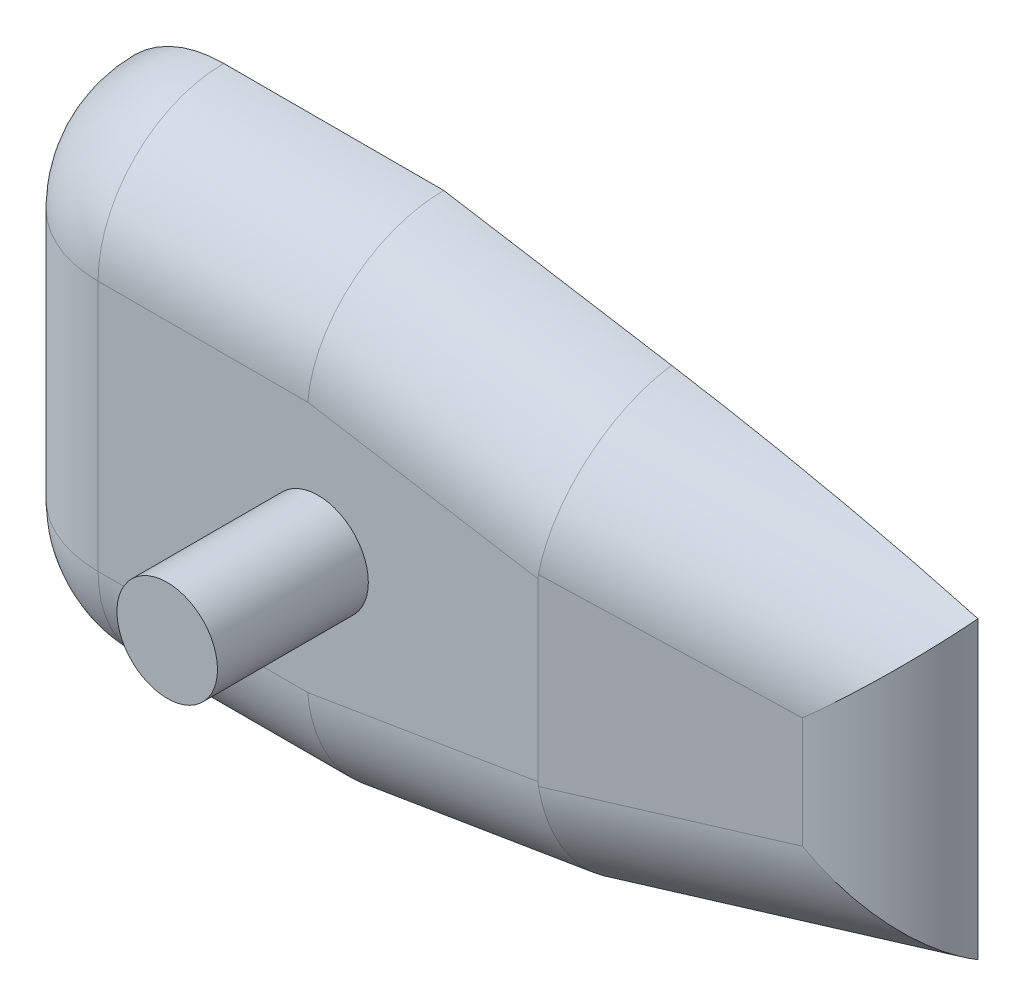
ISO-10303-21;
HEADER;
FILE_DESCRIPTION(('STEP AP214'),'2;1');
FILE_NAME('part.step','',(''),(''),'','','');
FILE_SCHEMA(('AUTOMOTIVE_DESIGN { 1 0 10303 214 1 1 1 1 }'));
ENDSEC;
DATA;
#1=APPLICATION_CONTEXT('core data for automotive mechanical design processes');
#2=APPLICATION_PROTOCOL_DEFINITION('international standard','automotive_design',2000,#1);
#3=PRODUCT_CONTEXT('',#1,'mechanical');
#4=PRODUCT('Part','Part','',(#3));
#5=PRODUCT_RELATED_PRODUCT_CATEGORY('part','',(#4));
#6=PRODUCT_DEFINITION_FORMATION('','',#4);
#7=PRODUCT_DEFINITION_CONTEXT('part definition',#1,'design');
#8=PRODUCT_DEFINITION('design','',#6,#7);
#9=PRODUCT_DEFINITION_SHAPE('','',#8);
#10=(LENGTH_UNIT() NAMED_UNIT(*) SI_UNIT(.MILLI.,.METRE.));
#11=(NAMED_UNIT(*) PLANE_ANGLE_UNIT() SI_UNIT($,.RADIAN.));
#12=(NAMED_UNIT(*) SI_UNIT($,.STERADIAN.) SOLID_ANGLE_UNIT());
#13=UNCERTAINTY_MEASURE_WITH_UNIT(LENGTH_MEASURE(1.E-05),#10,'distance_accuracy_value','');
#14=(GEOMETRIC_REPRESENTATION_CONTEXT(3) GLOBAL_UNCERTAINTY_ASSIGNED_CONTEXT((#13)) GLOBAL_UNIT_ASSIGNED_CONTEXT((#10,
#11,#12)) REPRESENTATION_CONTEXT('',''));
#15=CARTESIAN_POINT('',(0.,0.,0.));
#16=DIRECTION('',(0.,0.,1.));
#17=DIRECTION('',(1.,0.,0.));
#18=AXIS2_PLACEMENT_3D('',#15,#16,#17);
#19=CARTESIAN_POINT('',(0.,0.,500.));
#20=DIRECTION('',(0.,0.,1.));
#21=DIRECTION('',(1.,0.,0.));
#22=AXIS2_PLACEMENT_3D('',#19,#20,#21);
#23=PLANE('',#22);
#24=DIRECTION('',(0.,-1.,0.));
#25=VECTOR('',#24,1.);
#26=CARTESIAN_POINT('',(2250.,2000.,500.));
#27=LINE('',#26,#25);
#28=CARTESIAN_POINT('',(2250.,1349.14572813455,500.));
#29=VERTEX_POINT('',#28);
#30=CARTESIAN_POINT('',(2250.,650.854271865453,500.));
#31=VERTEX_POINT('',#30);
#32=EDGE_CURVE('E127',#29,#31,#27,.T.);
#33=ORIENTED_EDGE('',*,*,#32,.F.);
#34=DIRECTION('',(-0.986705865578197,0.16251626021288,0.));
#35=VECTOR('',#34,1.);
#36=CARTESIAN_POINT('',(275.769224697495,1674.31314994908,500.));
#37=LINE('',#36,#35);
#38=CARTESIAN_POINT('',(1334.09906367403,1500.,500.));
#39=VERTEX_POINT('',#38);
#40=EDGE_CURVE('E236',#29,#39,#37,.T.);
#41=ORIENTED_EDGE('',*,*,#40,.T.);
#42=DIRECTION('',(1.,0.,0.));
#43=VECTOR('',#42,1.);
#44=CARTESIAN_POINT('',(0.,1500.,500.));
#45=LINE('',#44,#43);
#46=CARTESIAN_POINT('',(500.,1500.,500.));
#47=VERTEX_POINT('',#46);
#48=EDGE_CURVE('E234',#39,#47,#45,.F.);
#49=ORIENTED_EDGE('',*,*,#48,.T.);
#50=DIRECTION('',(0.,1.,0.));
#51=VECTOR('',#50,1.);
#52=CARTESIAN_POINT('',(500.,0.,500.));
#53=LINE('',#52,#51);
#54=CARTESIAN_POINT('',(500.,500.,500.));
#55=VERTEX_POINT('',#54);
#56=EDGE_CURVE('E223',#47,#55,#53,.F.);
#57=ORIENTED_EDGE('',*,*,#56,.T.);
#58=DIRECTION('',(1.,0.,0.));
#59=VECTOR('',#58,1.);
#60=CARTESIAN_POINT('',(1375.,500.,500.));
#61=LINE('',#60,#59);
#62=CARTESIAN_POINT('',(1334.09906367403,500.,500.));
#63=VERTEX_POINT('',#62);
#64=EDGE_CURVE('E225',#55,#63,#61,.T.);
#65=ORIENTED_EDGE('',*,*,#64,.T.);
#66=DIRECTION('',(-0.986705865578197,-0.16251626021288,0.));
#67=VECTOR('',#66,1.);
#68=CARTESIAN_POINT('',(2168.74186989356,637.470579847922,500.));
#69=LINE('',#68,#67);
#70=EDGE_CURVE('E145',#63,#31,#69,.F.);
#71=ORIENTED_EDGE('',*,*,#70,.T.);
#72=EDGE_LOOP('',(#33,#41,#49,#57,#65,#71));
#73=FACE_BOUND('',#72,.T.);
#74=CARTESIAN_POINT('',(1375.,1000.,500.));
#75=DIRECTION('',(0.,0.,1.));
#76=DIRECTION('',(1.,0.,0.));
#77=AXIS2_PLACEMENT_3D('',#74,#75,#76);
#78=CIRCLE('',#77,200.);
#79=CARTESIAN_POINT('',(1575.,1000.,500.));
#80=VERTEX_POINT('',#79);
#81=EDGE_CURVE('E150',#80,#80,#78,.T.);
#82=ORIENTED_EDGE('',*,*,#81,.F.);
#83=EDGE_LOOP('',(#82));
#84=FACE_BOUND('',#83,.T.);
#85=ADVANCED_FACE('F39',(#73,#84),#23,.T.);
#86=CARTESIAN_POINT('',(0.,0.,0.));
#87=DIRECTION('',(0.,0.,1.));
#88=DIRECTION('',(1.,0.,0.));
#89=AXIS2_PLACEMENT_3D('',#86,#87,#88);
#90=PLANE('',#89);
#91=DIRECTION('',(0.,1.,0.));
#92=VECTOR('',#91,1.);
#93=CARTESIAN_POINT('',(0.,0.,0.));
#94=LINE('',#93,#92);
#95=CARTESIAN_POINT('',(0.,500.,0.));
#96=VERTEX_POINT('',#95);
#97=CARTESIAN_POINT('',(0.,1500.,0.));
#98=VERTEX_POINT('',#97);
#99=EDGE_CURVE('E164',#96,#98,#94,.T.);
#100=ORIENTED_EDGE('',*,*,#99,.T.);
#101=CARTESIAN_POINT('',(500.,1500.,0.));
#102=DIRECTION('',(0.,0.,1.));
#103=DIRECTION('',(1.,0.,0.));
#104=AXIS2_PLACEMENT_3D('',#101,#102,#103);
#105=CIRCLE('',#104,500.);
#106=CARTESIAN_POINT('',(500.,2000.,0.));
#107=VERTEX_POINT('',#106);
#108=EDGE_CURVE('E50',#98,#107,#105,.F.);
#109=ORIENTED_EDGE('',*,*,#108,.T.);
#110=DIRECTION('',(1.,0.,0.));
#111=VECTOR('',#110,1.);
#112=CARTESIAN_POINT('',(0.,2000.,0.));
#113=LINE('',#112,#111);
#114=CARTESIAN_POINT('',(1375.,2000.,0.));
#115=VERTEX_POINT('',#114);
#116=EDGE_CURVE('E161',#107,#115,#113,.T.);
#117=ORIENTED_EDGE('',*,*,#116,.T.);
#118=DIRECTION('',(-0.986705865578197,0.16251626021288,0.));
#119=VECTOR('',#118,1.);
#120=CARTESIAN_POINT('',(357.027354803935,2167.66608273818,0.));
#121=LINE('',#120,#119);
#122=CARTESIAN_POINT('',(2281.74837331005,1850.65320910187,0.));
#123=VERTEX_POINT('',#122);
#124=EDGE_CURVE('E137',#123,#115,#121,.T.);
#125=ORIENTED_EDGE('',*,*,#124,.F.);
#126=CARTESIAN_POINT('',(2200.49024320361,1357.30027631278,0.));
#127=DIRECTION('',(0.,0.,1.));
#128=DIRECTION('',(-0.986705865578197,0.16251626021288,0.));
#129=AXIS2_PLACEMENT_3D('',#126,#127,#128);
#130=ELLIPSE('',#129,2582.54722570767,500.);
#131=CARTESIAN_POINT('',(3500.,1587.24314244924,0.));
#132=VERTEX_POINT('',#131);
#133=EDGE_CURVE('E159',#123,#132,#130,.F.);
#134=ORIENTED_EDGE('',*,*,#133,.T.);
#135=DIRECTION('',(0.,-1.,0.));
#136=VECTOR('',#135,1.);
#137=CARTESIAN_POINT('',(3500.,0.,0.));
#138=LINE('',#137,#136);
#139=CARTESIAN_POINT('',(3500.,412.756857550764,0.));
#140=VERTEX_POINT('',#139);
#141=EDGE_CURVE('E123',#132,#140,#138,.T.);
#142=ORIENTED_EDGE('',*,*,#141,.T.);
#143=CARTESIAN_POINT('',(2200.49024320361,642.699723687224,0.));
#144=DIRECTION('',(0.,0.,1.));
#145=DIRECTION('',(0.986705865578197,0.16251626021288,0.));
#146=AXIS2_PLACEMENT_3D('',#143,#144,#145);
#147=ELLIPSE('',#146,2582.54722570767,500.);
#148=CARTESIAN_POINT('',(2281.74837331005,149.346790898126,0.));
#149=VERTEX_POINT('',#148);
#150=EDGE_CURVE('E132',#140,#149,#147,.F.);
#151=ORIENTED_EDGE('',*,*,#150,.T.);
#152=DIRECTION('',(-0.986705865578197,-0.16251626021288,0.));
#153=VECTOR('',#152,1.);
#154=CARTESIAN_POINT('',(36.315860396173,-220.489152405336,0.));
#155=LINE('',#154,#153);
#156=CARTESIAN_POINT('',(1375.,0.,0.));
#157=VERTEX_POINT('',#156);
#158=EDGE_CURVE('E126',#149,#157,#155,.T.);
#159=ORIENTED_EDGE('',*,*,#158,.T.);
#160=DIRECTION('',(1.,0.,0.));
#161=VECTOR('',#160,1.);
#162=CARTESIAN_POINT('',(0.,0.,0.));
#163=LINE('',#162,#161);
#164=CARTESIAN_POINT('',(500.,0.,0.));
#165=VERTEX_POINT('',#164);
#166=EDGE_CURVE('E120',#165,#157,#163,.T.);
#167=ORIENTED_EDGE('',*,*,#166,.F.);
#168=CARTESIAN_POINT('',(500.,500.,0.));
#169=DIRECTION('',(0.,0.,1.));
#170=DIRECTION('',(1.,0.,0.));
#171=AXIS2_PLACEMENT_3D('',#168,#169,#170);
#172=CIRCLE('',#171,500.);
#173=EDGE_CURVE('E53',#165,#96,#172,.F.);
#174=ORIENTED_EDGE('',*,*,#173,.T.);
#175=EDGE_LOOP('',(#100,#109,#117,#125,#134,#142,#151,#159,#167,#174));
#176=FACE_BOUND('',#175,.T.);
#177=ADVANCED_FACE('F128',(#176),#90,.F.);
#178=CARTESIAN_POINT('',(2250.,2000.,500.));
#179=DIRECTION('',(-0.196116135138184,0.,-0.98058067569092));
#180=DIRECTION('',(-0.98058067569092,0.,0.196116135138184));
#181=AXIS2_PLACEMENT_3D('',#178,#179,#180);
#182=PLANE('',#181);
#183=DIRECTION('',(0.968036508728296,-0.159441307319955,-0.193607301745659));
#184=VECTOR('',#183,1.);
#185=CARTESIAN_POINT('',(2174.2805185115,1377.76791268521,515.1438962977));
#186=LINE('',#185,#184);
#187=CARTESIAN_POINT('',(3126.25735825573,1220.97172731557,324.748528348854));
#188=VERTEX_POINT('',#187);
#189=CARTESIAN_POINT('',(2251.27010796338,1365.08727442255,499.745978407323));
#190=VERTEX_POINT('',#189);
#191=EDGE_CURVE('E230',#188,#190,#186,.F.);
#192=ORIENTED_EDGE('',*,*,#191,.T.);
#193=CARTESIAN_POINT('',(4750.,937.381022252193,0.));
#194=DIRECTION('',(-0.196116135138184,0.,-0.98058067569092));
#195=DIRECTION('',(-0.967034022165035,0.165647239561446,0.193406804433007));
#196=AXIS2_PLACEMENT_3D('',#193,#194,#195);
#197=ELLIPSE('',#196,2583.85993814115,500.);
#198=EDGE_CURVE('E228',#190,#29,#197,.F.);
#199=ORIENTED_EDGE('',*,*,#198,.T.);
#200=ORIENTED_EDGE('',*,*,#32,.T.);
#201=CARTESIAN_POINT('',(4750.,1062.61897774781,0.));
#202=DIRECTION('',(-0.196116135138184,0.,-0.98058067569092));
#203=DIRECTION('',(0.967034022165035,0.165647239561446,-0.193406804433007));
#204=AXIS2_PLACEMENT_3D('',#201,#202,#203);
#205=ELLIPSE('',#204,2583.85993814115,500.);
#206=CARTESIAN_POINT('',(2251.27010796339,634.912725577455,499.745978407323));
#207=VERTEX_POINT('',#206);
#208=EDGE_CURVE('E246',#31,#207,#205,.F.);
#209=ORIENTED_EDGE('',*,*,#208,.T.);
#210=DIRECTION('',(0.968036508728296,0.159441307319955,-0.193607301745659));
#211=VECTOR('',#210,1.);
#212=CARTESIAN_POINT('',(2460.72669231176,669.411457117187,457.854661537648));
#213=LINE('',#212,#211);
#214=CARTESIAN_POINT('',(3126.25735825573,779.02827268443,324.748528348854));
#215=VERTEX_POINT('',#214);
#216=EDGE_CURVE('E244',#207,#215,#213,.T.);
#217=ORIENTED_EDGE('',*,*,#216,.T.);
#218=DIRECTION('',(0.,-1.,0.));
#219=VECTOR('',#218,1.);
#220=CARTESIAN_POINT('',(3126.25735825573,2000.,324.748528348854));
#221=LINE('',#220,#219);
#222=EDGE_CURVE('E248',#215,#188,#221,.F.);
#223=ORIENTED_EDGE('',*,*,#222,.T.);
#224=EDGE_LOOP('',(#192,#199,#200,#209,#217,#223));
#225=FACE_BOUND('',#224,.T.);
#226=ADVANCED_FACE('F195',(#225),#182,.F.);
#227=CARTESIAN_POINT('',(1375.,1000.,1100.));
#228=DIRECTION('',(0.,0.,-1.));
#229=DIRECTION('',(-1.,0.,0.));
#230=AXIS2_PLACEMENT_3D('',#227,#228,#229);
#231=CYLINDRICAL_SURFACE('',#230,200.);
#232=CARTESIAN_POINT('',(1375.,1000.,1100.));
#233=DIRECTION('',(0.,0.,1.));
#234=DIRECTION('',(1.,0.,0.));
#235=AXIS2_PLACEMENT_3D('',#232,#233,#234);
#236=CIRCLE('',#235,200.);
#237=CARTESIAN_POINT('',(1575.,1000.,1100.));
#238=VERTEX_POINT('',#237);
#239=EDGE_CURVE('E139',#238,#238,#236,.T.);
#240=ORIENTED_EDGE('',*,*,#239,.F.);
#241=EDGE_LOOP('',(#240));
#242=FACE_BOUND('',#241,.T.);
#243=ORIENTED_EDGE('',*,*,#81,.T.);
#244=EDGE_LOOP('',(#243));
#245=FACE_BOUND('',#244,.T.);
#246=ADVANCED_FACE('F216',(#242,#245),#231,.T.);
#247=CARTESIAN_POINT('',(1375.,1000.,1100.));
#248=DIRECTION('',(0.,0.,1.));
#249=DIRECTION('',(1.,0.,0.));
#250=AXIS2_PLACEMENT_3D('',#247,#248,#249);
#251=PLANE('',#250);
#252=ORIENTED_EDGE('',*,*,#239,.T.);
#253=EDGE_LOOP('',(#252));
#254=FACE_BOUND('',#253,.T.);
#255=ADVANCED_FACE('F218',(#254),#251,.T.);
#256=CARTESIAN_POINT('',(500.,0.,0.));
#257=DIRECTION('',(0.,1.,0.));
#258=DIRECTION('',(0.,0.,1.));
#259=AXIS2_PLACEMENT_3D('',#256,#257,#258);
#260=CYLINDRICAL_SURFACE('',#259,500.);
#261=ORIENTED_EDGE('',*,*,#56,.F.);
#262=CARTESIAN_POINT('',(500.,1500.,0.));
#263=DIRECTION('',(0.,1.,0.));
#264=DIRECTION('',(0.,0.,1.));
#265=AXIS2_PLACEMENT_3D('',#262,#263,#264);
#266=CIRCLE('',#265,500.);
#267=EDGE_CURVE('E62',#47,#98,#266,.F.);
#268=ORIENTED_EDGE('',*,*,#267,.T.);
#269=ORIENTED_EDGE('',*,*,#99,.F.);
#270=CARTESIAN_POINT('',(500.,500.,0.));
#271=DIRECTION('',(0.,1.,0.));
#272=DIRECTION('',(0.,0.,1.));
#273=AXIS2_PLACEMENT_3D('',#270,#271,#272);
#274=CIRCLE('',#273,500.);
#275=EDGE_CURVE('E157',#96,#55,#274,.T.);
#276=ORIENTED_EDGE('',*,*,#275,.T.);
#277=EDGE_LOOP('',(#261,#268,#269,#276));
#278=FACE_BOUND('',#277,.T.);
#279=ADVANCED_FACE('F211',(#278),#260,.T.);
#280=CARTESIAN_POINT('',(0.,1500.,0.));
#281=DIRECTION('',(1.,0.,0.));
#282=DIRECTION('',(0.,0.,-1.));
#283=AXIS2_PLACEMENT_3D('',#280,#281,#282);
#284=CYLINDRICAL_SURFACE('',#283,500.);
#285=ORIENTED_EDGE('',*,*,#116,.F.);
#286=CARTESIAN_POINT('',(500.,1500.,0.));
#287=DIRECTION('',(1.,0.,0.));
#288=DIRECTION('',(0.,0.,-1.));
#289=AXIS2_PLACEMENT_3D('',#286,#287,#288);
#290=CIRCLE('',#289,500.);
#291=EDGE_CURVE('E155',#107,#47,#290,.T.);
#292=ORIENTED_EDGE('',*,*,#291,.T.);
#293=ORIENTED_EDGE('',*,*,#48,.F.);
#294=CARTESIAN_POINT('',(1334.09906367403,1500.,0.));
#295=DIRECTION('',(-0.996670925024453,0.0815295480847364,0.));
#296=DIRECTION('',(0.0815295480847359,0.996670925024453,0.));
#297=AXIS2_PLACEMENT_3D('',#294,#295,#296);
#298=ELLIPSE('',#297,501.670097367125,500.);
#299=EDGE_CURVE('E141',#115,#39,#298,.F.);
#300=ORIENTED_EDGE('',*,*,#299,.F.);
#301=EDGE_LOOP('',(#285,#292,#293,#300));
#302=FACE_BOUND('',#301,.T.);
#303=ADVANCED_FACE('F169',(#302),#284,.T.);
#304=CARTESIAN_POINT('',(0.,500.,0.));
#305=DIRECTION('',(-1.,0.,0.));
#306=DIRECTION('',(0.,0.,1.));
#307=AXIS2_PLACEMENT_3D('',#304,#305,#306);
#308=CYLINDRICAL_SURFACE('',#307,500.);
#309=ORIENTED_EDGE('',*,*,#64,.F.);
#310=CARTESIAN_POINT('',(500.,500.,0.));
#311=DIRECTION('',(-1.,0.,0.));
#312=DIRECTION('',(0.,0.,1.));
#313=AXIS2_PLACEMENT_3D('',#310,#311,#312);
#314=CIRCLE('',#313,500.);
#315=EDGE_CURVE('E11',#55,#165,#314,.F.);
#316=ORIENTED_EDGE('',*,*,#315,.T.);
#317=ORIENTED_EDGE('',*,*,#166,.T.);
#318=CARTESIAN_POINT('',(1334.09906367403,500.,0.));
#319=DIRECTION('',(-0.996670925024453,-0.0815295480847364,0.));
#320=DIRECTION('',(-0.0815295480847359,0.996670925024453,0.));
#321=AXIS2_PLACEMENT_3D('',#318,#319,#320);
#322=ELLIPSE('',#321,501.670097367125,500.);
#323=EDGE_CURVE('E125',#63,#157,#322,.F.);
#324=ORIENTED_EDGE('',*,*,#323,.F.);
#325=EDGE_LOOP('',(#309,#316,#317,#324));
#326=FACE_BOUND('',#325,.T.);
#327=ADVANCED_FACE('F119',(#326),#308,.T.);
#328=CARTESIAN_POINT('',(275.769224697495,1674.31314994908,0.));
#329=DIRECTION('',(-0.986705865578197,0.16251626021288,0.));
#330=DIRECTION('',(-0.16251626021288,-0.986705865578197,0.));
#331=AXIS2_PLACEMENT_3D('',#328,#329,#330);
#332=CYLINDRICAL_SURFACE('',#331,500.);
#333=ORIENTED_EDGE('',*,*,#40,.F.);
#334=ORIENTED_EDGE('',*,*,#198,.F.);
#335=CARTESIAN_POINT('',(2200.49024320361,1357.30027631278,0.));
#336=DIRECTION('',(-0.982027435060363,0.161745695186413,0.0972648285734846));
#337=DIRECTION('',(0.0959717768679154,-0.0158071161900097,0.99525853582));
#338=AXIS2_PLACEMENT_3D('',#335,#336,#337);
#339=ELLIPSE('',#338,502.38202638277,500.);
#340=EDGE_CURVE('E144',#123,#190,#339,.F.);
#341=ORIENTED_EDGE('',*,*,#340,.F.);
#342=ORIENTED_EDGE('',*,*,#124,.T.);
#343=ORIENTED_EDGE('',*,*,#299,.T.);
#344=EDGE_LOOP('',(#333,#334,#341,#342,#343));
#345=FACE_BOUND('',#344,.T.);
#346=ADVANCED_FACE('F206',(#345),#332,.T.);
#347=CARTESIAN_POINT('',(-44.9422697102668,272.863780383762,0.));
#348=DIRECTION('',(0.986705865578197,0.16251626021288,0.));
#349=DIRECTION('',(-0.16251626021288,0.986705865578197,0.));
#350=AXIS2_PLACEMENT_3D('',#347,#348,#349);
#351=CYLINDRICAL_SURFACE('',#350,500.);
#352=ORIENTED_EDGE('',*,*,#323,.T.);
#353=ORIENTED_EDGE('',*,*,#158,.F.);
#354=CARTESIAN_POINT('',(2200.49024320359,642.699723687222,1.26287869051112E-12));
#355=DIRECTION('',(0.982027435060363,0.161745695186413,-0.0972648285734846));
#356=DIRECTION('',(-0.0959717768679154,-0.0158071161900097,-0.99525853582));
#357=AXIS2_PLACEMENT_3D('',#354,#355,#356);
#358=ELLIPSE('',#357,502.38202638277,500.);
#359=EDGE_CURVE('E148',#207,#149,#358,.T.);
#360=ORIENTED_EDGE('',*,*,#359,.F.);
#361=ORIENTED_EDGE('',*,*,#208,.F.);
#362=ORIENTED_EDGE('',*,*,#70,.F.);
#363=EDGE_LOOP('',(#352,#353,#360,#361,#362));
#364=FACE_BOUND('',#363,.T.);
#365=ADVANCED_FACE('F140',(#364),#351,.T.);
#366=CARTESIAN_POINT('',(629.043462615558,1616.12680488022,314.28935611761));
#367=DIRECTION('',(-0.968036508728296,0.159441307319955,0.193607301745659));
#368=DIRECTION('',(0.196116135138184,0.,0.98058067569092));
#369=AXIS2_PLACEMENT_3D('',#366,#367,#368);
#370=CYLINDRICAL_SURFACE('',#369,500.);
#371=ORIENTED_EDGE('',*,*,#340,.T.);
#372=ORIENTED_EDGE('',*,*,#191,.F.);
#373=CARTESIAN_POINT('',(3028.19929068664,1220.97172731557,-165.541809496607));
#374=DIRECTION('',(-0.635700209293796,0.761393888641075,0.127140041858759));
#375=DIRECTION('',(-0.746608133790602,-0.648289554396816,0.14932162675812));
#376=AXIS2_PLACEMENT_3D('',#373,#374,#375);
#377=ELLIPSE('',#376,656.690324757391,500.);
#378=EDGE_CURVE('E245',#132,#188,#377,.F.);
#379=ORIENTED_EDGE('',*,*,#378,.F.);
#380=ORIENTED_EDGE('',*,*,#133,.F.);
#381=EDGE_LOOP('',(#371,#372,#379,#380));
#382=FACE_BOUND('',#381,.T.);
#383=ADVANCED_FACE('F201',(#382),#370,.T.);
#384=CARTESIAN_POINT('',(2362.66862474267,669.411457117187,-32.4356763078117));
#385=DIRECTION('',(0.968036508728296,0.159441307319955,-0.193607301745659));
#386=DIRECTION('',(-0.196116135138184,0.,-0.98058067569092));
#387=AXIS2_PLACEMENT_3D('',#384,#385,#386);
#388=CYLINDRICAL_SURFACE('',#387,500.);
#389=ORIENTED_EDGE('',*,*,#359,.T.);
#390=ORIENTED_EDGE('',*,*,#150,.F.);
#391=CARTESIAN_POINT('',(3028.19929068664,779.02827268443,-165.541809496607));
#392=DIRECTION('',(0.635700209293796,0.761393888641075,-0.127140041858759));
#393=DIRECTION('',(0.746608133790602,-0.648289554396816,-0.14932162675812));
#394=AXIS2_PLACEMENT_3D('',#391,#392,#393);
#395=ELLIPSE('',#394,656.690324757391,500.);
#396=EDGE_CURVE('E239',#215,#140,#395,.T.);
#397=ORIENTED_EDGE('',*,*,#396,.F.);
#398=ORIENTED_EDGE('',*,*,#216,.F.);
#399=EDGE_LOOP('',(#389,#390,#397,#398));
#400=FACE_BOUND('',#399,.T.);
#401=ADVANCED_FACE('F185',(#400),#388,.T.);
#402=CARTESIAN_POINT('',(3028.19929068664,0.,-165.541809496607));
#403=DIRECTION('',(0.,-1.,0.));
#404=DIRECTION('',(0.,0.,-1.));
#405=AXIS2_PLACEMENT_3D('',#402,#403,#404);
#406=CYLINDRICAL_SURFACE('',#405,500.);
#407=ORIENTED_EDGE('',*,*,#378,.T.);
#408=ORIENTED_EDGE('',*,*,#222,.F.);
#409=ORIENTED_EDGE('',*,*,#396,.T.);
#410=ORIENTED_EDGE('',*,*,#141,.F.);
#411=EDGE_LOOP('',(#407,#408,#409,#410));
#412=FACE_BOUND('',#411,.T.);
#413=ADVANCED_FACE('F176',(#412),#406,.T.);
#414=CARTESIAN_POINT('',(500.,1500.,0.));
#415=DIRECTION('',(0.,0.,1.));
#416=DIRECTION('',(1.,0.,0.));
#417=AXIS2_PLACEMENT_3D('',#414,#415,#416);
#418=SPHERICAL_SURFACE('',#417,500.);
#419=ORIENTED_EDGE('',*,*,#108,.F.);
#420=ORIENTED_EDGE('',*,*,#267,.F.);
#421=ORIENTED_EDGE('',*,*,#291,.F.);
#422=EDGE_LOOP('',(#419,#420,#421));
#423=FACE_BOUND('',#422,.T.);
#424=ADVANCED_FACE('F172',(#423),#418,.T.);
#425=CARTESIAN_POINT('',(500.,500.,0.));
#426=DIRECTION('',(0.,0.,1.));
#427=DIRECTION('',(1.,0.,0.));
#428=AXIS2_PLACEMENT_3D('',#425,#426,#427);
#429=SPHERICAL_SURFACE('',#428,500.);
#430=ORIENTED_EDGE('',*,*,#315,.F.);
#431=ORIENTED_EDGE('',*,*,#275,.F.);
#432=ORIENTED_EDGE('',*,*,#173,.F.);
#433=EDGE_LOOP('',(#430,#431,#432));
#434=FACE_BOUND('',#433,.T.);
#435=ADVANCED_FACE('F41',(#434),#429,.T.);
#436=CLOSED_SHELL('',(#85,#177,#226,#246,#255,#279,#303,#327,#346,#365,#383,#401,#413,#424,#435));
#437=MANIFOLD_SOLID_BREP('B2',#436);
#438=ADVANCED_BREP_SHAPE_REPRESENTATION('',(#18,#437),#14);
#439=SHAPE_DEFINITION_REPRESENTATION(#9,#438);
ENDSEC;
END-ISO-10303-21;
